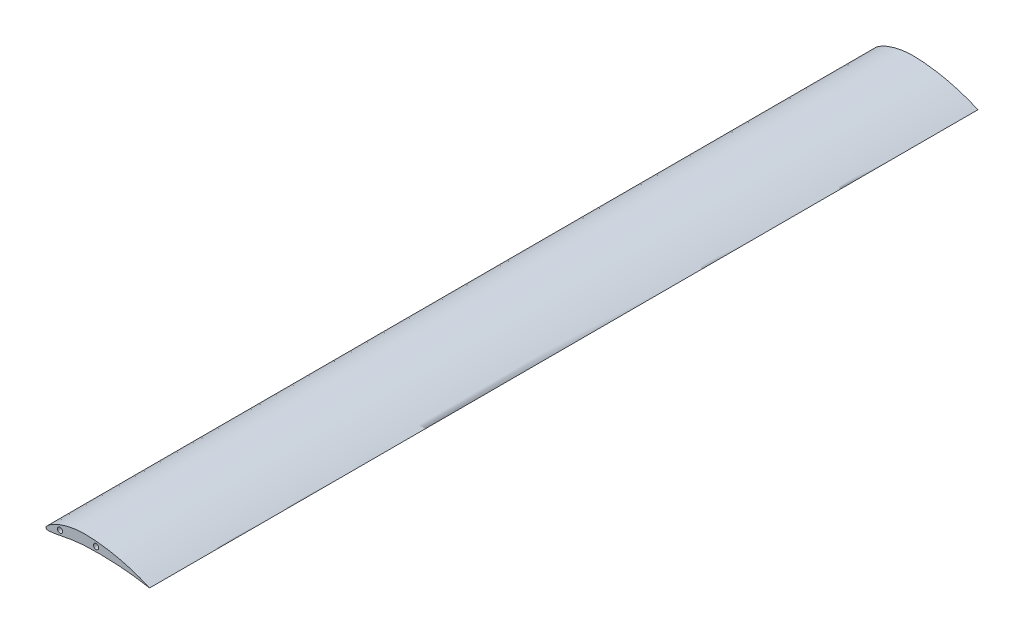
ISO-10303-21;
HEADER;
FILE_DESCRIPTION(('STEP AP214'),'2;1');
FILE_NAME('part.step','',(''),(''),'','','');
FILE_SCHEMA(('AUTOMOTIVE_DESIGN { 1 0 10303 214 1 1 1 1 }'));
ENDSEC;
DATA;
#1=APPLICATION_CONTEXT('core data for automotive mechanical design processes');
#2=APPLICATION_PROTOCOL_DEFINITION('international standard','automotive_design',2000,#1);
#3=PRODUCT_CONTEXT('',#1,'mechanical');
#4=PRODUCT('Part','Part','',(#3));
#5=PRODUCT_RELATED_PRODUCT_CATEGORY('part','',(#4));
#6=PRODUCT_DEFINITION_FORMATION('','',#4);
#7=PRODUCT_DEFINITION_CONTEXT('part definition',#1,'design');
#8=PRODUCT_DEFINITION('design','',#6,#7);
#9=PRODUCT_DEFINITION_SHAPE('','',#8);
#10=(LENGTH_UNIT() NAMED_UNIT(*) SI_UNIT(.MILLI.,.METRE.));
#11=(NAMED_UNIT(*) PLANE_ANGLE_UNIT() SI_UNIT($,.RADIAN.));
#12=(NAMED_UNIT(*) SI_UNIT($,.STERADIAN.) SOLID_ANGLE_UNIT());
#13=UNCERTAINTY_MEASURE_WITH_UNIT(LENGTH_MEASURE(1.E-05),#10,'distance_accuracy_value','');
#14=(GEOMETRIC_REPRESENTATION_CONTEXT(3) GLOBAL_UNCERTAINTY_ASSIGNED_CONTEXT((#13)) GLOBAL_UNIT_ASSIGNED_CONTEXT((#10,
#11,#12)) REPRESENTATION_CONTEXT('',''));
#15=CARTESIAN_POINT('',(0.,0.,0.));
#16=DIRECTION('',(0.,0.,1.));
#17=DIRECTION('',(1.,0.,0.));
#18=AXIS2_PLACEMENT_3D('',#15,#16,#17);
#19=CARTESIAN_POINT('',(127.,0.,1016.));
#20=CARTESIAN_POINT('',(127.001446740949,0.00485304542693298,1016.));
#21=CARTESIAN_POINT('',(126.73876393927,0.104699090631858,1016.));
#22=CARTESIAN_POINT('',(126.474753018578,0.230570888545978,1016.));
#23=CARTESIAN_POINT('',(125.817130693051,0.504147683526229,1016.));
#24=CARTESIAN_POINT('',(125.001340583628,0.851737476785081,1016.));
#25=CARTESIAN_POINT('',(123.915893777031,1.30307281100842,1016.));
#26=CARTESIAN_POINT('',(122.610984580291,1.83860855411796,1016.));
#27=CARTESIAN_POINT('',(121.07328875138,2.45675750938371,1016.));
#28=CARTESIAN_POINT('',(119.313870121568,3.14840471873947,1016.));
#29=CARTESIAN_POINT('',(117.336142204773,3.90504261986683,1016.));
#30=CARTESIAN_POINT('',(115.147463158374,4.71790551471261,1016.));
#31=CARTESIAN_POINT('',(112.754834777186,5.57696997969977,1016.));
#32=CARTESIAN_POINT('',(110.166433493662,6.47219479521974,1016.));
#33=CARTESIAN_POINT('',(107.391089371968,7.39261068954382,1016.));
#34=CARTESIAN_POINT('',(104.438678089033,8.32809079492343,1016.));
#35=CARTESIAN_POINT('',(101.319597344996,9.26755249968612,1016.));
#36=CARTESIAN_POINT('',(98.0451159256631,10.2004945178264,1016.));
#37=CARTESIAN_POINT('',(94.6272129147533,11.1163159341897,1016.));
#38=CARTESIAN_POINT('',(91.0786674209606,12.0049602933897,1016.));
#39=CARTESIAN_POINT('',(87.4128263244118,12.8563833937677,1016.));
#40=CARTESIAN_POINT('',(83.6437862815007,13.6616673372202,1016.));
#41=CARTESIAN_POINT('',(79.786126099526,14.4118545509743,1016.));
#42=CARTESIAN_POINT('',(75.8550784527907,15.0990775937844,1016.));
#43=CARTESIAN_POINT('',(71.8663922347838,15.7160803640313,1016.));
#44=CARTESIAN_POINT('',(67.8362405851793,16.2564343293856,1016.));
#45=CARTESIAN_POINT('',(63.7811532374956,16.7143195790207,1016.));
#46=CARTESIAN_POINT('',(59.7181028389043,17.0860880136089,1016.));
#47=CARTESIAN_POINT('',(55.664145868971,17.3663171204819,1016.));
#48=CARTESIAN_POINT('',(51.6056966494191,17.5605270573557,1016.));
#49=CARTESIAN_POINT('',(47.5497328428005,17.6412084309252,1016.));
#50=CARTESIAN_POINT('',(43.5147767235397,17.5377898241465,1016.));
#51=CARTESIAN_POINT('',(39.5532507754877,17.2717306826031,1016.));
#52=CARTESIAN_POINT('',(35.6932108679612,16.8469485904249,1016.));
#53=CARTESIAN_POINT('',(31.9543231042848,16.2757794261286,1016.));
#54=CARTESIAN_POINT('',(28.3553498369153,15.5706457688607,1016.));
#55=CARTESIAN_POINT('',(24.9139891767857,14.7470634244435,1016.));
#56=CARTESIAN_POINT('',(21.6468070856428,13.8211972346152,1016.));
#57=CARTESIAN_POINT('',(18.5690823089211,12.8108025457848,1016.));
#58=CARTESIAN_POINT('',(15.6942554032694,11.735335776058,1016.));
#59=CARTESIAN_POINT('',(13.0349108441311,10.6130796881738,1016.));
#60=CARTESIAN_POINT('',(10.6014175298084,9.46400508993328,1016.));
#61=CARTESIAN_POINT('',(8.4029043127994,8.3069694892668,1016.));
#62=CARTESIAN_POINT('',(6.44708150264091,7.16004663016334,1016.));
#63=CARTESIAN_POINT('',(4.73952407884635,6.04133260959639,1016.));
#64=CARTESIAN_POINT('',(3.28495545799051,4.96630732103151,1016.));
#65=CARTESIAN_POINT('',(2.08608158418327,3.94936707124772,1016.));
#66=CARTESIAN_POINT('',(1.14387397082259,3.00253543547702,1016.));
#67=CARTESIAN_POINT('',(0.45672090062385,2.13406612503368,1016.));
#68=CARTESIAN_POINT('',(0.0221849878994104,1.34647580191843,1016.));
#69=CARTESIAN_POINT('',(-0.159206007278547,0.627366588293914,1016.));
#70=CARTESIAN_POINT('',(-0.0470828732713945,-0.0212235727411065,1016.));
#71=CARTESIAN_POINT('',(0.362847501753699,-0.534303323418988,1016.));
#72=CARTESIAN_POINT('',(1.01289234740258,-0.879848471092611,1016.));
#73=CARTESIAN_POINT('',(1.87388052217914,-1.09321099388124,1016.));
#74=CARTESIAN_POINT('',(2.95258202801775,-1.19094456647631,1016.));
#75=CARTESIAN_POINT('',(4.24816630788426,-1.18101798834628,1016.));
#76=CARTESIAN_POINT('',(5.75660782541668,-1.07016082518392,1016.));
#77=CARTESIAN_POINT('',(7.47104429112206,-0.866369076324408,1016.));
#78=CARTESIAN_POINT('',(9.38333326113087,-0.579018676211947,1016.));
#79=CARTESIAN_POINT('',(11.4844889036613,-0.218438272920343,1016.));
#80=CARTESIAN_POINT('',(13.7650604208697,0.203541055551978,1016.));
#81=CARTESIAN_POINT('',(16.2152559609236,0.674841857811047,1016.));
#82=CARTESIAN_POINT('',(18.8251917362272,1.18246534174928,1016.));
#83=CARTESIAN_POINT('',(21.5848457277992,1.71332048998136,1016.));
#84=CARTESIAN_POINT('',(24.4844768366737,2.25347882305546,1016.));
#85=CARTESIAN_POINT('',(27.5142468199507,2.78956675425508,1016.));
#86=CARTESIAN_POINT('',(30.664573463488,3.30783001581822,1016.));
#87=CARTESIAN_POINT('',(33.926048193344,3.79490953028153,1016.));
#88=CARTESIAN_POINT('',(37.2893710251616,4.23758987969383,1016.));
#89=CARTESIAN_POINT('',(40.7452543886218,4.62435020475859,1016.));
#90=CARTESIAN_POINT('',(44.2844728902634,4.94164078252061,1016.));
#91=CARTESIAN_POINT('',(47.9054231011673,5.1842115441884,1016.));
#92=CARTESIAN_POINT('',(51.6294117002794,5.32554502532992,1016.));
#93=CARTESIAN_POINT('',(55.4417086014046,5.42366145454576,1016.));
#94=CARTESIAN_POINT('',(59.3213225460364,5.49603371427573,1016.));
#95=CARTESIAN_POINT('',(63.2232293699418,5.53136069914349,1016.));
#96=CARTESIAN_POINT('',(67.132995147508,5.52871610147864,1016.));
#97=CARTESIAN_POINT('',(71.03618168627,5.48569714130323,1016.));
#98=CARTESIAN_POINT('',(74.918003595937,5.40147442412023,1016.));
#99=CARTESIAN_POINT('',(78.7635808748608,5.27574575001373,1016.));
#100=CARTESIAN_POINT('',(82.5579647519773,5.10981232661564,1016.));
#101=CARTESIAN_POINT('',(86.2860786315387,4.90559330232371,1016.));
#102=CARTESIAN_POINT('',(89.9330393736926,4.66562159131208,1016.));
#103=CARTESIAN_POINT('',(93.4839427382108,4.39366032969049,1016.));
#104=CARTESIAN_POINT('',(96.9242896210674,4.09427858009075,1016.));
#105=CARTESIAN_POINT('',(100.239598093467,3.77192771505523,1016.));
#106=CARTESIAN_POINT('',(103.415981320204,3.43241172498258,1016.));
#107=CARTESIAN_POINT('',(106.439784221751,3.0813076432661,1016.));
#108=CARTESIAN_POINT('',(109.298006735396,2.7248432849179,1016.));
#109=CARTESIAN_POINT('',(111.97807434903,2.36879624225681,1016.));
#110=CARTESIAN_POINT('',(114.468240594373,2.01954538706209,1016.));
#111=CARTESIAN_POINT('',(116.75725845236,1.68297829659092,1016.));
#112=CARTESIAN_POINT('',(118.834992523942,1.36485026162254,1016.));
#113=CARTESIAN_POINT('',(120.691205524571,1.07029034402028,1016.));
#114=CARTESIAN_POINT('',(122.319472245133,0.804274149666963,1016.));
#115=CARTESIAN_POINT('',(123.706085777878,0.572434642211898,1016.));
#116=CARTESIAN_POINT('',(124.86192399926,0.37376381640828,1016.));
#117=CARTESIAN_POINT('',(125.734848518054,0.225212322271852,1016.));
#118=CARTESIAN_POINT('',(126.434544292899,0.0954891935948975,1016.));
#119=CARTESIAN_POINT('',(126.72425996568,0.0562114245212569,1016.));
#120=CARTESIAN_POINT('',(126.998552721876,-0.00485484736150257,1016.));
#121=CARTESIAN_POINT('',(127.,0.,1016.));
#122=B_SPLINE_CURVE_WITH_KNOTS('',3,(#19,#20,#21,#22,#23,#24,#25,#26,#27,#28,#29,#30,#31,#32,
#33,#34,#35,#36,#37,#38,#39,#40,#41,#42,#43,#44,#45,#46,#47,#48,#49,#50,#51,#52,#53,#54,#55,#56,
#57,#58,#59,#60,#61,#62,#63,#64,#65,#66,#67,#68,#69,#70,#71,#72,#73,#74,#75,#76,#77,#78,#79,#80,
#81,#82,#83,#84,#85,#86,#87,#88,#89,#90,#91,#92,#93,#94,#95,#96,#97,#98,#99,#100,#101,#102,#103,
#104,#105,#106,#107,#108,#109,#110,#111,#112,#113,#114,#115,#116,#117,#118,#119,#120,#121),
.UNSPECIFIED.,.T.,.F.,(4,1,1,1,1,1,1,1,1,1,1,1,1,1,1,1,1,1,1,1,1,1,1,1,1,1,1,1,1,1,1,1,1,1,1,1,
1,1,1,1,1,1,1,1,1,1,1,1,1,1,1,1,1,1,1,1,1,1,1,1,1,1,1,1,1,1,1,1,1,1,1,1,1,1,1,1,1,1,1,1,1,1,1,1,
1,1,1,1,1,1,1,1,1,1,1,1,1,1,1,1,4),(0.,0.000500326049519175,0.00199990760163715,
0.00449101627273274,0.00796298086574612,0.0124002118425483,0.0177826366211744,
0.0240860326313178,0.0312831052168073,0.0393424270236328,0.0482285836149498,0.057904259586067,
0.0683279588406355,0.0794565200862165,0.0912430416416612,0.103640125631855,0.11659760446237,
0.130063468683701,0.143984589749349,0.158306115281006,0.172972351114055,0.187927319554514,
0.20311311609449,0.21847170022127,0.233944808256595,0.249473445037778,0.264998854871646,
0.280462152993957,0.295803844975311,0.311323628717017,0.326706508328528,0.341810405087739,
0.356582637386559,0.370971506072796,0.38492377668075,0.398386752583945,0.411306988431166,
0.423632653932156,0.435311864853231,0.446295011418478,0.456534872077711,0.465987533398347,
0.474613040323127,0.482377355112773,0.489253053218404,0.495223640795803,0.500285940491077,
0.504461055430133,0.507811561379389,0.510480593826733,0.512762221689423,0.515043424046115,
0.517702036811693,0.521013381255434,0.525103947691201,0.530021122126524,0.535771893077695,
0.542341397137363,0.549702684379151,0.557818571065016,0.566648243037682,0.576147103665607,
0.586268140188205,0.596964793437867,0.608189910026611,0.619898639505957,0.632046652594614,
0.644592153625543,0.657497245151002,0.670724392767715,0.684239662545192,0.698010812754851,
0.712098303326406,0.726728065548618,0.741493630132347,0.756341332592584,0.77121932541031,
0.786072643114755,0.800847936994409,0.815489997805182,0.829943037606439,0.844152553752633,
0.858061385805726,0.871615338111085,0.884758319653612,0.897436299434092,0.909594640457841,
0.921181699282087,0.932145358799731,0.942436617257412,0.952008463169593,0.960816148037907,
0.968817229154603,0.975973664666453,0.982250117606877,0.987615555936444,0.992043304182074,
0.995510912453481,0.998000497540123,0.999499488179542,1.),.UNSPECIFIED.);
#123=DIRECTION('',(0.,0.,-1.));
#124=VECTOR('',#123,1.);
#125=SURFACE_OF_LINEAR_EXTRUSION('',#122,#124);
#126=CARTESIAN_POINT('',(127.,0.,1016.));
#127=VERTEX_POINT('',#126);
#128=EDGE_CURVE('E10',#127,#127,#122,.T.);
#129=ORIENTED_EDGE('',*,*,#128,.F.);
#130=EDGE_LOOP('',(#129));
#131=FACE_BOUND('',#130,.T.);
#132=CARTESIAN_POINT('',(127.,0.,0.));
#133=CARTESIAN_POINT('',(127.001446740949,0.00485304542693298,0.));
#134=CARTESIAN_POINT('',(126.73876393927,0.104699090631858,0.));
#135=CARTESIAN_POINT('',(126.474753018578,0.230570888545978,0.));
#136=CARTESIAN_POINT('',(125.817130693051,0.504147683526229,0.));
#137=CARTESIAN_POINT('',(125.001340583628,0.851737476785081,0.));
#138=CARTESIAN_POINT('',(123.915893777031,1.30307281100842,0.));
#139=CARTESIAN_POINT('',(122.610984580291,1.83860855411796,0.));
#140=CARTESIAN_POINT('',(121.07328875138,2.45675750938371,0.));
#141=CARTESIAN_POINT('',(119.313870121568,3.14840471873947,0.));
#142=CARTESIAN_POINT('',(117.336142204773,3.90504261986683,0.));
#143=CARTESIAN_POINT('',(115.147463158374,4.71790551471261,0.));
#144=CARTESIAN_POINT('',(112.754834777186,5.57696997969977,0.));
#145=CARTESIAN_POINT('',(110.166433493662,6.47219479521974,0.));
#146=CARTESIAN_POINT('',(107.391089371968,7.39261068954382,0.));
#147=CARTESIAN_POINT('',(104.438678089033,8.32809079492343,0.));
#148=CARTESIAN_POINT('',(101.319597344996,9.26755249968612,0.));
#149=CARTESIAN_POINT('',(98.0451159256631,10.2004945178264,0.));
#150=CARTESIAN_POINT('',(94.6272129147533,11.1163159341897,0.));
#151=CARTESIAN_POINT('',(91.0786674209606,12.0049602933897,0.));
#152=CARTESIAN_POINT('',(87.4128263244118,12.8563833937677,0.));
#153=CARTESIAN_POINT('',(83.6437862815007,13.6616673372202,0.));
#154=CARTESIAN_POINT('',(79.786126099526,14.4118545509743,0.));
#155=CARTESIAN_POINT('',(75.8550784527907,15.0990775937844,0.));
#156=CARTESIAN_POINT('',(71.8663922347838,15.7160803640313,0.));
#157=CARTESIAN_POINT('',(67.8362405851793,16.2564343293856,0.));
#158=CARTESIAN_POINT('',(63.7811532374956,16.7143195790207,0.));
#159=CARTESIAN_POINT('',(59.7181028389043,17.0860880136089,0.));
#160=CARTESIAN_POINT('',(55.664145868971,17.3663171204819,0.));
#161=CARTESIAN_POINT('',(51.6056966494191,17.5605270573557,0.));
#162=CARTESIAN_POINT('',(47.5497328428005,17.6412084309252,0.));
#163=CARTESIAN_POINT('',(43.5147767235397,17.5377898241465,0.));
#164=CARTESIAN_POINT('',(39.5532507754877,17.2717306826031,0.));
#165=CARTESIAN_POINT('',(35.6932108679612,16.8469485904249,0.));
#166=CARTESIAN_POINT('',(31.9543231042848,16.2757794261286,0.));
#167=CARTESIAN_POINT('',(28.3553498369153,15.5706457688607,0.));
#168=CARTESIAN_POINT('',(24.9139891767857,14.7470634244435,0.));
#169=CARTESIAN_POINT('',(21.6468070856428,13.8211972346152,0.));
#170=CARTESIAN_POINT('',(18.5690823089211,12.8108025457848,0.));
#171=CARTESIAN_POINT('',(15.6942554032694,11.735335776058,0.));
#172=CARTESIAN_POINT('',(13.0349108441311,10.6130796881738,0.));
#173=CARTESIAN_POINT('',(10.6014175298084,9.46400508993328,0.));
#174=CARTESIAN_POINT('',(8.4029043127994,8.3069694892668,0.));
#175=CARTESIAN_POINT('',(6.44708150264091,7.16004663016334,0.));
#176=CARTESIAN_POINT('',(4.73952407884635,6.04133260959639,0.));
#177=CARTESIAN_POINT('',(3.28495545799051,4.96630732103151,0.));
#178=CARTESIAN_POINT('',(2.08608158418327,3.94936707124772,0.));
#179=CARTESIAN_POINT('',(1.14387397082259,3.00253543547702,0.));
#180=CARTESIAN_POINT('',(0.45672090062385,2.13406612503368,0.));
#181=CARTESIAN_POINT('',(0.0221849878994104,1.34647580191843,0.));
#182=CARTESIAN_POINT('',(-0.159206007278547,0.627366588293914,0.));
#183=CARTESIAN_POINT('',(-0.0470828732713945,-0.0212235727411065,0.));
#184=CARTESIAN_POINT('',(0.362847501753699,-0.534303323418988,0.));
#185=CARTESIAN_POINT('',(1.01289234740258,-0.879848471092611,0.));
#186=CARTESIAN_POINT('',(1.87388052217914,-1.09321099388124,0.));
#187=CARTESIAN_POINT('',(2.95258202801775,-1.19094456647631,0.));
#188=CARTESIAN_POINT('',(4.24816630788426,-1.18101798834628,0.));
#189=CARTESIAN_POINT('',(5.75660782541668,-1.07016082518392,0.));
#190=CARTESIAN_POINT('',(7.47104429112206,-0.866369076324408,0.));
#191=CARTESIAN_POINT('',(9.38333326113087,-0.579018676211947,0.));
#192=CARTESIAN_POINT('',(11.4844889036613,-0.218438272920343,0.));
#193=CARTESIAN_POINT('',(13.7650604208697,0.203541055551978,0.));
#194=CARTESIAN_POINT('',(16.2152559609236,0.674841857811047,0.));
#195=CARTESIAN_POINT('',(18.8251917362272,1.18246534174928,0.));
#196=CARTESIAN_POINT('',(21.5848457277992,1.71332048998136,0.));
#197=CARTESIAN_POINT('',(24.4844768366737,2.25347882305546,0.));
#198=CARTESIAN_POINT('',(27.5142468199507,2.78956675425508,0.));
#199=CARTESIAN_POINT('',(30.664573463488,3.30783001581822,0.));
#200=CARTESIAN_POINT('',(33.926048193344,3.79490953028153,0.));
#201=CARTESIAN_POINT('',(37.2893710251616,4.23758987969383,0.));
#202=CARTESIAN_POINT('',(40.7452543886218,4.62435020475859,0.));
#203=CARTESIAN_POINT('',(44.2844728902634,4.94164078252061,0.));
#204=CARTESIAN_POINT('',(47.9054231011673,5.1842115441884,0.));
#205=CARTESIAN_POINT('',(51.6294117002794,5.32554502532992,0.));
#206=CARTESIAN_POINT('',(55.4417086014046,5.42366145454576,0.));
#207=CARTESIAN_POINT('',(59.3213225460364,5.49603371427573,0.));
#208=CARTESIAN_POINT('',(63.2232293699418,5.53136069914349,0.));
#209=CARTESIAN_POINT('',(67.132995147508,5.52871610147864,0.));
#210=CARTESIAN_POINT('',(71.03618168627,5.48569714130323,0.));
#211=CARTESIAN_POINT('',(74.918003595937,5.40147442412023,0.));
#212=CARTESIAN_POINT('',(78.7635808748608,5.27574575001373,0.));
#213=CARTESIAN_POINT('',(82.5579647519773,5.10981232661564,0.));
#214=CARTESIAN_POINT('',(86.2860786315387,4.90559330232371,0.));
#215=CARTESIAN_POINT('',(89.9330393736926,4.66562159131208,0.));
#216=CARTESIAN_POINT('',(93.4839427382108,4.39366032969049,0.));
#217=CARTESIAN_POINT('',(96.9242896210674,4.09427858009075,0.));
#218=CARTESIAN_POINT('',(100.239598093467,3.77192771505523,0.));
#219=CARTESIAN_POINT('',(103.415981320204,3.43241172498258,0.));
#220=CARTESIAN_POINT('',(106.439784221751,3.0813076432661,0.));
#221=CARTESIAN_POINT('',(109.298006735396,2.7248432849179,0.));
#222=CARTESIAN_POINT('',(111.97807434903,2.36879624225681,0.));
#223=CARTESIAN_POINT('',(114.468240594373,2.01954538706209,0.));
#224=CARTESIAN_POINT('',(116.75725845236,1.68297829659092,0.));
#225=CARTESIAN_POINT('',(118.834992523942,1.36485026162254,0.));
#226=CARTESIAN_POINT('',(120.691205524571,1.07029034402028,0.));
#227=CARTESIAN_POINT('',(122.319472245133,0.804274149666963,0.));
#228=CARTESIAN_POINT('',(123.706085777878,0.572434642211898,0.));
#229=CARTESIAN_POINT('',(124.86192399926,0.37376381640828,0.));
#230=CARTESIAN_POINT('',(125.734848518054,0.225212322271852,0.));
#231=CARTESIAN_POINT('',(126.434544292899,0.0954891935948975,0.));
#232=CARTESIAN_POINT('',(126.72425996568,0.0562114245212569,0.));
#233=CARTESIAN_POINT('',(126.998552721876,-0.00485484736150257,0.));
#234=CARTESIAN_POINT('',(127.,0.,0.));
#235=B_SPLINE_CURVE_WITH_KNOTS('',3,(#132,#133,#134,#135,#136,#137,#138,#139,#140,#141,#142,
#143,#144,#145,#146,#147,#148,#149,#150,#151,#152,#153,#154,#155,#156,#157,#158,#159,#160,#161,
#162,#163,#164,#165,#166,#167,#168,#169,#170,#171,#172,#173,#174,#175,#176,#177,#178,#179,#180,
#181,#182,#183,#184,#185,#186,#187,#188,#189,#190,#191,#192,#193,#194,#195,#196,#197,#198,#199,
#200,#201,#202,#203,#204,#205,#206,#207,#208,#209,#210,#211,#212,#213,#214,#215,#216,#217,#218,
#219,#220,#221,#222,#223,#224,#225,#226,#227,#228,#229,#230,#231,#232,#233,#234),.UNSPECIFIED.,
.T.,.F.,(4,1,1,1,1,1,1,1,1,1,1,1,1,1,1,1,1,1,1,1,1,1,1,1,1,1,1,1,1,1,1,1,1,1,1,1,1,1,1,1,1,1,1,
1,1,1,1,1,1,1,1,1,1,1,1,1,1,1,1,1,1,1,1,1,1,1,1,1,1,1,1,1,1,1,1,1,1,1,1,1,1,1,1,1,1,1,1,1,1,1,1,
1,1,1,1,1,1,1,1,1,4),(0.,0.000500326049519175,0.00199990760163715,0.00449101627273274,
0.00796298086574612,0.0124002118425483,0.0177826366211744,0.0240860326313178,0.0312831052168073,
0.0393424270236328,0.0482285836149498,0.057904259586067,0.0683279588406355,0.0794565200862165,
0.0912430416416612,0.103640125631855,0.11659760446237,0.130063468683701,0.143984589749349,
0.158306115281006,0.172972351114055,0.187927319554514,0.20311311609449,0.21847170022127,
0.233944808256595,0.249473445037778,0.264998854871646,0.280462152993957,0.295803844975311,
0.311323628717017,0.326706508328528,0.341810405087739,0.356582637386559,0.370971506072796,
0.38492377668075,0.398386752583945,0.411306988431166,0.423632653932156,0.435311864853231,
0.446295011418478,0.456534872077711,0.465987533398347,0.474613040323127,0.482377355112773,
0.489253053218404,0.495223640795803,0.500285940491077,0.504461055430133,0.507811561379389,
0.510480593826733,0.512762221689423,0.515043424046115,0.517702036811693,0.521013381255434,
0.525103947691201,0.530021122126524,0.535771893077695,0.542341397137363,0.549702684379151,
0.557818571065016,0.566648243037682,0.576147103665607,0.586268140188205,0.596964793437867,
0.608189910026611,0.619898639505957,0.632046652594614,0.644592153625543,0.657497245151002,
0.670724392767715,0.684239662545192,0.698010812754851,0.712098303326406,0.726728065548618,
0.741493630132347,0.756341332592584,0.77121932541031,0.786072643114755,0.800847936994409,
0.815489997805182,0.829943037606439,0.844152553752633,0.858061385805726,0.871615338111085,
0.884758319653612,0.897436299434092,0.909594640457841,0.921181699282087,0.932145358799731,
0.942436617257412,0.952008463169593,0.960816148037907,0.968817229154603,0.975973664666453,
0.982250117606877,0.987615555936444,0.992043304182074,0.995510912453481,0.998000497540123,
0.999499488179542,1.),.UNSPECIFIED.);
#236=CARTESIAN_POINT('',(127.,0.,0.));
#237=VERTEX_POINT('',#236);
#238=EDGE_CURVE('E36',#237,#237,#235,.T.);
#239=ORIENTED_EDGE('',*,*,#238,.T.);
#240=EDGE_LOOP('',(#239));
#241=FACE_BOUND('',#240,.T.);
#242=ADVANCED_FACE('F32',(#131,#241),#125,.F.);
#243=CARTESIAN_POINT('',(1.15922211118971,2.98501464162526,1016.));
#244=DIRECTION('',(0.,0.,-1.));
#245=DIRECTION('',(-1.,0.,0.));
#246=AXIS2_PLACEMENT_3D('',#243,#244,#245);
#247=PLANE('',#246);
#248=CARTESIAN_POINT('',(17.1183286544709,6.35045526393489,1016.));
#249=DIRECTION('',(0.,0.,1.));
#250=DIRECTION('',(1.,0.,0.));
#251=AXIS2_PLACEMENT_3D('',#248,#249,#250);
#252=CIRCLE('',#251,3.17500000000001);
#253=CARTESIAN_POINT('',(20.2933286544709,6.35045526393489,1016.));
#254=VERTEX_POINT('',#253);
#255=EDGE_CURVE('E58',#254,#254,#252,.T.);
#256=ORIENTED_EDGE('',*,*,#255,.F.);
#257=EDGE_LOOP('',(#256));
#258=FACE_BOUND('',#257,.T.);
#259=CARTESIAN_POINT('',(61.3031601754013,11.1984613970781,1016.));
#260=DIRECTION('',(0.,0.,1.));
#261=DIRECTION('',(1.,0.,0.));
#262=AXIS2_PLACEMENT_3D('',#259,#260,#261);
#263=CIRCLE('',#262,3.175);
#264=CARTESIAN_POINT('',(64.4781601754013,11.1984613970781,1016.));
#265=VERTEX_POINT('',#264);
#266=EDGE_CURVE('E49',#265,#265,#263,.T.);
#267=ORIENTED_EDGE('',*,*,#266,.F.);
#268=EDGE_LOOP('',(#267));
#269=FACE_BOUND('',#268,.T.);
#270=ORIENTED_EDGE('',*,*,#128,.T.);
#271=EDGE_LOOP('',(#270));
#272=FACE_BOUND('',#271,.T.);
#273=ADVANCED_FACE('F74',(#258,#269,#272),#247,.F.);
#274=CARTESIAN_POINT('',(1.15922211118971,2.98501464162526,0.));
#275=DIRECTION('',(0.,0.,-1.));
#276=DIRECTION('',(-1.,0.,0.));
#277=AXIS2_PLACEMENT_3D('',#274,#275,#276);
#278=PLANE('',#277);
#279=CARTESIAN_POINT('',(17.1183286544709,6.35045526393489,0.));
#280=DIRECTION('',(0.,0.,1.));
#281=DIRECTION('',(1.,0.,0.));
#282=AXIS2_PLACEMENT_3D('',#279,#280,#281);
#283=CIRCLE('',#282,3.17500000000001);
#284=CARTESIAN_POINT('',(20.2933286544709,6.35045526393489,0.));
#285=VERTEX_POINT('',#284);
#286=EDGE_CURVE('E44',#285,#285,#283,.T.);
#287=ORIENTED_EDGE('',*,*,#286,.T.);
#288=EDGE_LOOP('',(#287));
#289=FACE_BOUND('',#288,.T.);
#290=CARTESIAN_POINT('',(61.3031601754013,11.1984613970781,0.));
#291=DIRECTION('',(0.,0.,1.));
#292=DIRECTION('',(1.,0.,0.));
#293=AXIS2_PLACEMENT_3D('',#290,#291,#292);
#294=CIRCLE('',#293,3.175);
#295=CARTESIAN_POINT('',(64.4781601754013,11.1984613970781,0.));
#296=VERTEX_POINT('',#295);
#297=EDGE_CURVE('E55',#296,#296,#294,.T.);
#298=ORIENTED_EDGE('',*,*,#297,.T.);
#299=EDGE_LOOP('',(#298));
#300=FACE_BOUND('',#299,.T.);
#301=ORIENTED_EDGE('',*,*,#238,.F.);
#302=EDGE_LOOP('',(#301));
#303=FACE_BOUND('',#302,.T.);
#304=ADVANCED_FACE('F64',(#289,#300,#303),#278,.T.);
#305=CARTESIAN_POINT('',(61.3031601754013,11.1984613970781,0.));
#306=DIRECTION('',(0.,0.,1.));
#307=DIRECTION('',(1.,0.,0.));
#308=AXIS2_PLACEMENT_3D('',#305,#306,#307);
#309=CYLINDRICAL_SURFACE('',#308,3.175);
#310=ORIENTED_EDGE('',*,*,#297,.F.);
#311=EDGE_LOOP('',(#310));
#312=FACE_BOUND('',#311,.T.);
#313=ORIENTED_EDGE('',*,*,#266,.T.);
#314=EDGE_LOOP('',(#313));
#315=FACE_BOUND('',#314,.T.);
#316=ADVANCED_FACE('F70',(#312,#315),#309,.F.);
#317=CARTESIAN_POINT('',(17.1183286544709,6.35045526393489,0.));
#318=DIRECTION('',(0.,0.,1.));
#319=DIRECTION('',(1.,0.,0.));
#320=AXIS2_PLACEMENT_3D('',#317,#318,#319);
#321=CYLINDRICAL_SURFACE('',#320,3.17500000000001);
#322=ORIENTED_EDGE('',*,*,#286,.F.);
#323=EDGE_LOOP('',(#322));
#324=FACE_BOUND('',#323,.T.);
#325=ORIENTED_EDGE('',*,*,#255,.T.);
#326=EDGE_LOOP('',(#325));
#327=FACE_BOUND('',#326,.T.);
#328=ADVANCED_FACE('F67',(#324,#327),#321,.F.);
#329=CLOSED_SHELL('',(#242,#273,#304,#316,#328));
#330=MANIFOLD_SOLID_BREP('B2',#329);
#331=ADVANCED_BREP_SHAPE_REPRESENTATION('',(#18,#330),#14);
#332=SHAPE_DEFINITION_REPRESENTATION(#9,#331);
ENDSEC;
END-ISO-10303-21;
